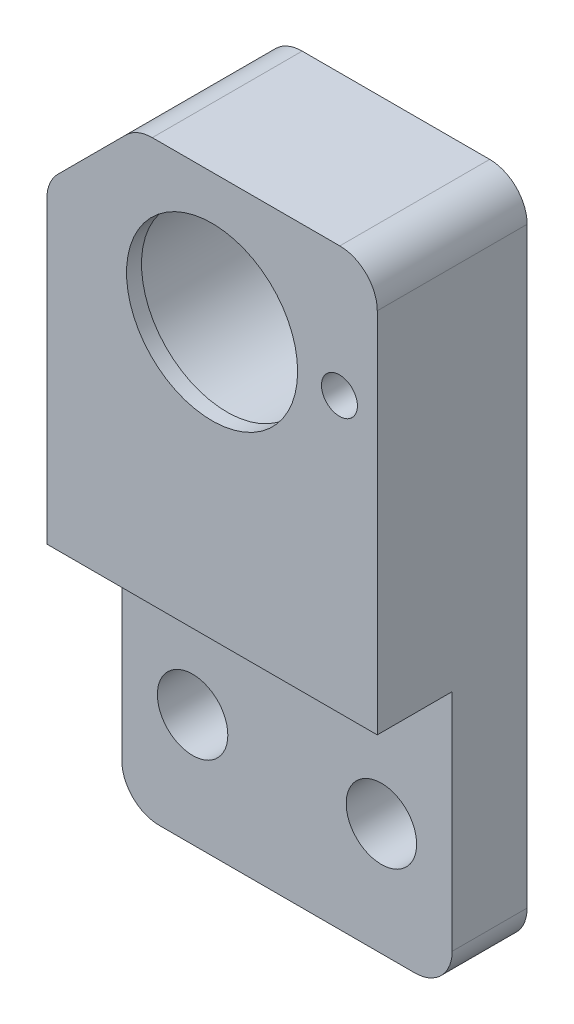
ISO-10303-21;
HEADER;
FILE_DESCRIPTION(('STEP AP214'),'2;1');
FILE_NAME('part.step','',(''),(''),'','','');
FILE_SCHEMA(('AUTOMOTIVE_DESIGN { 1 0 10303 214 1 1 1 1 }'));
ENDSEC;
DATA;
#1=APPLICATION_CONTEXT('core data for automotive mechanical design processes');
#2=APPLICATION_PROTOCOL_DEFINITION('international standard','automotive_design',2000,#1);
#3=PRODUCT_CONTEXT('',#1,'mechanical');
#4=PRODUCT('Part','Part','',(#3));
#5=PRODUCT_RELATED_PRODUCT_CATEGORY('part','',(#4));
#6=PRODUCT_DEFINITION_FORMATION('','',#4);
#7=PRODUCT_DEFINITION_CONTEXT('part definition',#1,'design');
#8=PRODUCT_DEFINITION('design','',#6,#7);
#9=PRODUCT_DEFINITION_SHAPE('','',#8);
#10=(LENGTH_UNIT() NAMED_UNIT(*) SI_UNIT(.MILLI.,.METRE.));
#11=(NAMED_UNIT(*) PLANE_ANGLE_UNIT() SI_UNIT($,.RADIAN.));
#12=(NAMED_UNIT(*) SI_UNIT($,.STERADIAN.) SOLID_ANGLE_UNIT());
#13=UNCERTAINTY_MEASURE_WITH_UNIT(LENGTH_MEASURE(1.E-05),#10,'distance_accuracy_value','');
#14=(GEOMETRIC_REPRESENTATION_CONTEXT(3) GLOBAL_UNCERTAINTY_ASSIGNED_CONTEXT((#13)) GLOBAL_UNIT_ASSIGNED_CONTEXT((#10,
#11,#12)) REPRESENTATION_CONTEXT('',''));
#15=CARTESIAN_POINT('',(0.,0.,0.));
#16=DIRECTION('',(0.,0.,1.));
#17=DIRECTION('',(1.,0.,0.));
#18=AXIS2_PLACEMENT_3D('',#15,#16,#17);
#19=CARTESIAN_POINT('',(225.31987165171,63.67054945062,12.7));
#20=DIRECTION('',(0.,1.,0.));
#21=DIRECTION('',(0.,0.,1.));
#22=AXIS2_PLACEMENT_3D('',#19,#20,#21);
#23=PLANE('',#22);
#24=DIRECTION('',(1.,0.,0.));
#25=VECTOR('',#24,1.);
#26=CARTESIAN_POINT('',(225.31987165171,63.67054945062,6.35));
#27=LINE('',#26,#25);
#28=CARTESIAN_POINT('',(214.49487165202,63.67054945062,6.35));
#29=VERTEX_POINT('',#28);
#30=CARTESIAN_POINT('',(236.1448716514,63.67054945062,6.35));
#31=VERTEX_POINT('',#30);
#32=EDGE_CURVE('E251',#29,#31,#27,.T.);
#33=ORIENTED_EDGE('',*,*,#32,.F.);
#34=DIRECTION('',(0.,0.,-1.));
#35=VECTOR('',#34,1.);
#36=CARTESIAN_POINT('',(214.49487165202,63.67054945062,12.7));
#37=LINE('',#36,#35);
#38=CARTESIAN_POINT('',(214.49487165202,63.67054945062,0.));
#39=VERTEX_POINT('',#38);
#40=EDGE_CURVE('E96',#29,#39,#37,.T.);
#41=ORIENTED_EDGE('',*,*,#40,.T.);
#42=DIRECTION('',(1.,0.,0.));
#43=VECTOR('',#42,1.);
#44=CARTESIAN_POINT('',(225.31987165171,63.67054945062,0.));
#45=LINE('',#44,#43);
#46=CARTESIAN_POINT('',(236.1448716514,63.67054945062,0.));
#47=VERTEX_POINT('',#46);
#48=EDGE_CURVE('E159',#39,#47,#45,.T.);
#49=ORIENTED_EDGE('',*,*,#48,.T.);
#50=DIRECTION('',(0.,0.,-1.));
#51=VECTOR('',#50,1.);
#52=CARTESIAN_POINT('',(236.1448716514,63.67054945062,12.7));
#53=LINE('',#52,#51);
#54=EDGE_CURVE('E11',#31,#47,#53,.T.);
#55=ORIENTED_EDGE('',*,*,#54,.F.);
#56=EDGE_LOOP('',(#33,#41,#49,#55));
#57=FACE_BOUND('',#56,.T.);
#58=ADVANCED_FACE('F33',(#57),#23,.F.);
#59=CARTESIAN_POINT('',(236.1448716514,66.84554945062,12.7));
#60=DIRECTION('',(0.,0.,-1.));
#61=DIRECTION('',(-1.,0.,0.));
#62=AXIS2_PLACEMENT_3D('',#59,#60,#61);
#63=CYLINDRICAL_SURFACE('',#62,3.175);
#64=CARTESIAN_POINT('',(236.1448716514,66.84554945062,6.35));
#65=DIRECTION('',(0.,0.,1.));
#66=DIRECTION('',(1.,0.,0.));
#67=AXIS2_PLACEMENT_3D('',#64,#65,#66);
#68=CIRCLE('',#67,3.175);
#69=CARTESIAN_POINT('',(239.3198716514,66.84554945062,6.35));
#70=VERTEX_POINT('',#69);
#71=EDGE_CURVE('E248',#31,#70,#68,.T.);
#72=ORIENTED_EDGE('',*,*,#71,.F.);
#73=ORIENTED_EDGE('',*,*,#54,.T.);
#74=CARTESIAN_POINT('',(236.1448716514,66.84554945062,0.));
#75=DIRECTION('',(0.,0.,1.));
#76=DIRECTION('',(1.,0.,0.));
#77=AXIS2_PLACEMENT_3D('',#74,#75,#76);
#78=CIRCLE('',#77,3.175);
#79=CARTESIAN_POINT('',(239.3198716514,66.84554945062,0.));
#80=VERTEX_POINT('',#79);
#81=EDGE_CURVE('E161',#47,#80,#78,.T.);
#82=ORIENTED_EDGE('',*,*,#81,.T.);
#83=DIRECTION('',(0.,0.,-1.));
#84=VECTOR('',#83,1.);
#85=CARTESIAN_POINT('',(239.3198716514,66.84554945062,12.7));
#86=LINE('',#85,#84);
#87=EDGE_CURVE('E41',#70,#80,#86,.T.);
#88=ORIENTED_EDGE('',*,*,#87,.F.);
#89=EDGE_LOOP('',(#72,#73,#82,#88));
#90=FACE_BOUND('',#89,.T.);
#91=ADVANCED_FACE('F207',(#90),#63,.T.);
#92=CARTESIAN_POINT('',(239.3198716514,42.7259684474256,12.7));
#93=DIRECTION('',(-1.,0.,0.));
#94=DIRECTION('',(0.,0.,1.));
#95=AXIS2_PLACEMENT_3D('',#92,#93,#94);
#96=PLANE('',#95);
#97=DIRECTION('',(0.,0.,1.));
#98=VECTOR('',#97,1.);
#99=CARTESIAN_POINT('',(239.3198716514,85.90062945062,6.35));
#100=LINE('',#99,#98);
#101=CARTESIAN_POINT('',(239.3198716514,85.90062945062,6.35));
#102=VERTEX_POINT('',#101);
#103=CARTESIAN_POINT('',(239.3198716514,85.90062945062,12.7));
#104=VERTEX_POINT('',#103);
#105=EDGE_CURVE('E48',#102,#104,#100,.T.);
#106=ORIENTED_EDGE('',*,*,#105,.F.);
#107=DIRECTION('',(0.,1.,0.));
#108=VECTOR('',#107,1.);
#109=CARTESIAN_POINT('',(239.3198716514,42.7259684474256,6.35));
#110=LINE('',#109,#108);
#111=EDGE_CURVE('E203',#70,#102,#110,.T.);
#112=ORIENTED_EDGE('',*,*,#111,.F.);
#113=ORIENTED_EDGE('',*,*,#87,.T.);
#114=DIRECTION('',(0.,1.,0.));
#115=VECTOR('',#114,1.);
#116=CARTESIAN_POINT('',(239.3198716514,42.7259684474256,0.));
#117=LINE('',#116,#115);
#118=CARTESIAN_POINT('',(239.3198716514,117.02562945094,0.));
#119=VERTEX_POINT('',#118);
#120=EDGE_CURVE('E164',#80,#119,#117,.T.);
#121=ORIENTED_EDGE('',*,*,#120,.T.);
#122=DIRECTION('',(0.,0.,-1.));
#123=VECTOR('',#122,1.);
#124=CARTESIAN_POINT('',(239.3198716514,117.02562945094,12.7));
#125=LINE('',#124,#123);
#126=CARTESIAN_POINT('',(239.3198716514,117.02562945094,12.7));
#127=VERTEX_POINT('',#126);
#128=EDGE_CURVE('E194',#127,#119,#125,.T.);
#129=ORIENTED_EDGE('',*,*,#128,.F.);
#130=DIRECTION('',(0.,1.,0.));
#131=VECTOR('',#130,1.);
#132=CARTESIAN_POINT('',(239.3198716514,42.7259684474256,12.7));
#133=LINE('',#132,#131);
#134=EDGE_CURVE('E104',#104,#127,#133,.T.);
#135=ORIENTED_EDGE('',*,*,#134,.F.);
#136=EDGE_LOOP('',(#106,#112,#113,#121,#129,#135));
#137=FACE_BOUND('',#136,.T.);
#138=ADVANCED_FACE('F199',(#137),#96,.F.);
#139=CARTESIAN_POINT('',(211.31987165202,42.7259684474256,12.7));
#140=DIRECTION('',(-1.,0.,0.));
#141=DIRECTION('',(0.,0.,1.));
#142=AXIS2_PLACEMENT_3D('',#139,#140,#141);
#143=PLANE('',#142);
#144=DIRECTION('',(0.,1.,0.));
#145=VECTOR('',#144,1.);
#146=CARTESIAN_POINT('',(211.31987165202,42.7259684474256,6.35));
#147=LINE('',#146,#145);
#148=CARTESIAN_POINT('',(211.31987165202,66.84554945062,6.35));
#149=VERTEX_POINT('',#148);
#150=CARTESIAN_POINT('',(211.31987165202,85.90062945062,6.35));
#151=VERTEX_POINT('',#150);
#152=EDGE_CURVE('E242',#149,#151,#147,.T.);
#153=ORIENTED_EDGE('',*,*,#152,.T.);
#154=DIRECTION('',(0.,0.,1.));
#155=VECTOR('',#154,1.);
#156=CARTESIAN_POINT('',(211.31987165202,85.90062945062,6.35));
#157=LINE('',#156,#155);
#158=CARTESIAN_POINT('',(211.31987165202,85.90062945062,12.7));
#159=VERTEX_POINT('',#158);
#160=EDGE_CURVE('E229',#151,#159,#157,.T.);
#161=ORIENTED_EDGE('',*,*,#160,.T.);
#162=DIRECTION('',(0.,1.,0.));
#163=VECTOR('',#162,1.);
#164=CARTESIAN_POINT('',(211.31987165202,42.7259684474256,12.7));
#165=LINE('',#164,#163);
#166=CARTESIAN_POINT('',(211.31987165202,111.26550139032,12.7));
#167=VERTEX_POINT('',#166);
#168=EDGE_CURVE('E57',#159,#167,#165,.T.);
#169=ORIENTED_EDGE('',*,*,#168,.T.);
#170=DIRECTION('',(0.,0.,-1.));
#171=VECTOR('',#170,1.);
#172=CARTESIAN_POINT('',(211.31987165202,111.26550139032,12.7));
#173=LINE('',#172,#171);
#174=CARTESIAN_POINT('',(211.31987165202,111.26550139032,0.));
#175=VERTEX_POINT('',#174);
#176=EDGE_CURVE('E187',#167,#175,#173,.T.);
#177=ORIENTED_EDGE('',*,*,#176,.T.);
#178=DIRECTION('',(0.,1.,0.));
#179=VECTOR('',#178,1.);
#180=CARTESIAN_POINT('',(211.31987165202,42.7259684474256,0.));
#181=LINE('',#180,#179);
#182=CARTESIAN_POINT('',(211.31987165202,66.84554945062,0.));
#183=VERTEX_POINT('',#182);
#184=EDGE_CURVE('E176',#183,#175,#181,.T.);
#185=ORIENTED_EDGE('',*,*,#184,.F.);
#186=DIRECTION('',(0.,0.,-1.));
#187=VECTOR('',#186,1.);
#188=CARTESIAN_POINT('',(211.31987165202,66.84554945062,12.7));
#189=LINE('',#188,#187);
#190=EDGE_CURVE('E185',#149,#183,#189,.T.);
#191=ORIENTED_EDGE('',*,*,#190,.F.);
#192=EDGE_LOOP('',(#153,#161,#169,#177,#185,#191));
#193=FACE_BOUND('',#192,.T.);
#194=ADVANCED_FACE('F277',(#193),#143,.T.);
#195=CARTESIAN_POINT('',(214.49487165202,66.84554945062,12.7));
#196=DIRECTION('',(0.,0.,-1.));
#197=DIRECTION('',(-1.,0.,0.));
#198=AXIS2_PLACEMENT_3D('',#195,#196,#197);
#199=CYLINDRICAL_SURFACE('',#198,3.17499999999999);
#200=CARTESIAN_POINT('',(214.49487165202,66.84554945062,6.35));
#201=DIRECTION('',(0.,0.,1.));
#202=DIRECTION('',(1.,0.,0.));
#203=AXIS2_PLACEMENT_3D('',#200,#201,#202);
#204=CIRCLE('',#203,3.17499999999999);
#205=EDGE_CURVE('E235',#149,#29,#204,.T.);
#206=ORIENTED_EDGE('',*,*,#205,.F.);
#207=ORIENTED_EDGE('',*,*,#190,.T.);
#208=CARTESIAN_POINT('',(214.49487165202,66.84554945062,0.));
#209=DIRECTION('',(0.,0.,1.));
#210=DIRECTION('',(1.,0.,0.));
#211=AXIS2_PLACEMENT_3D('',#208,#209,#210);
#212=CIRCLE('',#211,3.17499999999999);
#213=EDGE_CURVE('E179',#183,#39,#212,.T.);
#214=ORIENTED_EDGE('',*,*,#213,.T.);
#215=ORIENTED_EDGE('',*,*,#40,.F.);
#216=EDGE_LOOP('',(#206,#207,#214,#215));
#217=FACE_BOUND('',#216,.T.);
#218=ADVANCED_FACE('F288',(#217),#199,.T.);
#219=CARTESIAN_POINT('',(217.31987165098,73.20062945062,12.7));
#220=DIRECTION('',(0.,0.,-1.));
#221=DIRECTION('',(-1.,0.,0.));
#222=AXIS2_PLACEMENT_3D('',#219,#220,#221);
#223=CYLINDRICAL_SURFACE('',#222,2.9845);
#224=CARTESIAN_POINT('',(217.31987165098,73.20062945062,0.));
#225=DIRECTION('',(0.,0.,1.));
#226=DIRECTION('',(1.,0.,0.));
#227=AXIS2_PLACEMENT_3D('',#224,#225,#226);
#228=CIRCLE('',#227,2.9845);
#229=CARTESIAN_POINT('',(220.30437165098,73.20062945062,0.));
#230=VERTEX_POINT('',#229);
#231=EDGE_CURVE('E155',#230,#230,#228,.T.);
#232=ORIENTED_EDGE('',*,*,#231,.F.);
#233=EDGE_LOOP('',(#232));
#234=FACE_BOUND('',#233,.T.);
#235=CARTESIAN_POINT('',(217.31987165098,73.20062945062,6.35));
#236=DIRECTION('',(0.,0.,1.));
#237=DIRECTION('',(1.,0.,0.));
#238=AXIS2_PLACEMENT_3D('',#235,#236,#237);
#239=CIRCLE('',#238,2.9845);
#240=CARTESIAN_POINT('',(220.30437165098,73.20062945062,6.35));
#241=VERTEX_POINT('',#240);
#242=EDGE_CURVE('E254',#241,#241,#239,.T.);
#243=ORIENTED_EDGE('',*,*,#242,.T.);
#244=EDGE_LOOP('',(#243));
#245=FACE_BOUND('',#244,.T.);
#246=ADVANCED_FACE('F292',(#234,#245),#223,.F.);
#247=CARTESIAN_POINT('',(233.31987165244,73.20062945062,12.7));
#248=DIRECTION('',(0.,0.,-1.));
#249=DIRECTION('',(-1.,0.,0.));
#250=AXIS2_PLACEMENT_3D('',#247,#248,#249);
#251=CYLINDRICAL_SURFACE('',#250,2.9845);
#252=CARTESIAN_POINT('',(233.31987165244,73.20062945062,0.));
#253=DIRECTION('',(0.,0.,1.));
#254=DIRECTION('',(1.,0.,0.));
#255=AXIS2_PLACEMENT_3D('',#252,#253,#254);
#256=CIRCLE('',#255,2.9845);
#257=CARTESIAN_POINT('',(236.30437165244,73.20062945062,0.));
#258=VERTEX_POINT('',#257);
#259=EDGE_CURVE('E152',#258,#258,#256,.T.);
#260=ORIENTED_EDGE('',*,*,#259,.F.);
#261=EDGE_LOOP('',(#260));
#262=FACE_BOUND('',#261,.T.);
#263=CARTESIAN_POINT('',(233.31987165244,73.20062945062,6.35));
#264=DIRECTION('',(0.,0.,1.));
#265=DIRECTION('',(1.,0.,0.));
#266=AXIS2_PLACEMENT_3D('',#263,#264,#265);
#267=CIRCLE('',#266,2.9845);
#268=CARTESIAN_POINT('',(236.30437165244,73.20062945062,6.35));
#269=VERTEX_POINT('',#268);
#270=EDGE_CURVE('E239',#269,#269,#267,.T.);
#271=ORIENTED_EDGE('',*,*,#270,.T.);
#272=EDGE_LOOP('',(#271));
#273=FACE_BOUND('',#272,.T.);
#274=ADVANCED_FACE('F35',(#262,#273),#251,.F.);
#275=CARTESIAN_POINT('',(225.31987165171,42.7259684474256,12.7));
#276=DIRECTION('',(0.,0.,1.));
#277=DIRECTION('',(1.,0.,0.));
#278=AXIS2_PLACEMENT_3D('',#275,#276,#277);
#279=PLANE('',#278);
#280=CARTESIAN_POINT('',(225.31987165044,109.20062944946,12.7));
#281=DIRECTION('',(0.,0.,1.));
#282=DIRECTION('',(1.,0.,0.));
#283=AXIS2_PLACEMENT_3D('',#280,#281,#282);
#284=CIRCLE('',#283,7.25000000086001);
#285=CARTESIAN_POINT('',(232.5698716513,109.20062944946,12.7));
#286=VERTEX_POINT('',#285);
#287=EDGE_CURVE('E149',#286,#286,#284,.T.);
#288=ORIENTED_EDGE('',*,*,#287,.F.);
#289=EDGE_LOOP('',(#288));
#290=FACE_BOUND('',#289,.T.);
#291=CARTESIAN_POINT('',(236.11487165044,109.20062944946,12.7));
#292=DIRECTION('',(0.,0.,1.));
#293=DIRECTION('',(1.,0.,0.));
#294=AXIS2_PLACEMENT_3D('',#291,#292,#293);
#295=CIRCLE('',#294,1.524);
#296=CARTESIAN_POINT('',(237.63887165044,109.20062944946,12.7));
#297=VERTEX_POINT('',#296);
#298=EDGE_CURVE('E146',#297,#297,#295,.T.);
#299=ORIENTED_EDGE('',*,*,#298,.F.);
#300=EDGE_LOOP('',(#299));
#301=FACE_BOUND('',#300,.T.);
#302=ORIENTED_EDGE('',*,*,#168,.F.);
#303=DIRECTION('',(1.,0.,0.));
#304=VECTOR('',#303,1.);
#305=CARTESIAN_POINT('',(225.31987165171,85.90062945062,12.7));
#306=LINE('',#305,#304);
#307=EDGE_CURVE('E237',#159,#104,#306,.T.);
#308=ORIENTED_EDGE('',*,*,#307,.T.);
#309=ORIENTED_EDGE('',*,*,#134,.T.);
#310=CARTESIAN_POINT('',(236.1448716514,117.02562945097,12.7));
#311=DIRECTION('',(0.,0.,1.));
#312=DIRECTION('',(1.,0.,0.));
#313=AXIS2_PLACEMENT_3D('',#310,#311,#312);
#314=CIRCLE('',#313,3.175);
#315=CARTESIAN_POINT('',(236.14487165143,120.20062945097,12.7));
#316=VERTEX_POINT('',#315);
#317=EDGE_CURVE('E221',#127,#316,#314,.T.);
#318=ORIENTED_EDGE('',*,*,#317,.T.);
#319=DIRECTION('',(-1.,0.,0.));
#320=VECTOR('',#319,1.);
#321=CARTESIAN_POINT('',(225.31987165171,120.20062945097,12.7));
#322=LINE('',#321,#320);
#323=CARTESIAN_POINT('',(220.25499971267,120.20062945097,12.7));
#324=VERTEX_POINT('',#323);
#325=EDGE_CURVE('E122',#316,#324,#322,.T.);
#326=ORIENTED_EDGE('',*,*,#325,.T.);
#327=CARTESIAN_POINT('',(220.25499971267,117.02562945094,12.7));
#328=DIRECTION('',(0.,0.,1.));
#329=DIRECTION('',(1.,0.,0.));
#330=AXIS2_PLACEMENT_3D('',#327,#328,#329);
#331=CIRCLE('',#330,3.17500000003022);
#332=CARTESIAN_POINT('',(218.009935681112,119.270693479959,12.7));
#333=VERTEX_POINT('',#332);
#334=EDGE_CURVE('E115',#324,#333,#331,.T.);
#335=ORIENTED_EDGE('',*,*,#334,.T.);
#336=DIRECTION('',(-0.707106781186548,-0.707106781186548,0.));
#337=VECTOR('',#336,1.);
#338=CARTESIAN_POINT('',(183.392541150144,84.6532989489913,12.7));
#339=LINE('',#338,#337);
#340=CARTESIAN_POINT('',(212.249807620492,113.510565419339,12.7));
#341=VERTEX_POINT('',#340);
#342=EDGE_CURVE('E119',#333,#341,#339,.T.);
#343=ORIENTED_EDGE('',*,*,#342,.T.);
#344=CARTESIAN_POINT('',(214.49487165205,111.26550139032,12.7));
#345=DIRECTION('',(0.,0.,1.));
#346=DIRECTION('',(1.,0.,0.));
#347=AXIS2_PLACEMENT_3D('',#344,#345,#346);
#348=CIRCLE('',#347,3.17500000003021);
#349=EDGE_CURVE('E140',#341,#167,#348,.T.);
#350=ORIENTED_EDGE('',*,*,#349,.T.);
#351=EDGE_LOOP('',(#302,#308,#309,#318,#326,#335,#343,#350));
#352=FACE_BOUND('',#351,.T.);
#353=ADVANCED_FACE('F117',(#290,#301,#352),#279,.T.);
#354=CARTESIAN_POINT('',(225.31987165171,42.7259684474256,0.));
#355=DIRECTION('',(0.,0.,1.));
#356=DIRECTION('',(1.,0.,0.));
#357=AXIS2_PLACEMENT_3D('',#354,#355,#356);
#358=PLANE('',#357);
#359=CARTESIAN_POINT('',(236.11487165044,109.20062944946,0.));
#360=DIRECTION('',(0.,0.,1.));
#361=DIRECTION('',(1.,0.,0.));
#362=AXIS2_PLACEMENT_3D('',#359,#360,#361);
#363=CIRCLE('',#362,1.524);
#364=CARTESIAN_POINT('',(237.63887165044,109.20062944946,0.));
#365=VERTEX_POINT('',#364);
#366=EDGE_CURVE('E181',#365,#365,#363,.T.);
#367=ORIENTED_EDGE('',*,*,#366,.T.);
#368=EDGE_LOOP('',(#367));
#369=FACE_BOUND('',#368,.T.);
#370=ORIENTED_EDGE('',*,*,#48,.F.);
#371=ORIENTED_EDGE('',*,*,#213,.F.);
#372=ORIENTED_EDGE('',*,*,#184,.T.);
#373=CARTESIAN_POINT('',(214.49487165205,111.26550139032,0.));
#374=DIRECTION('',(0.,0.,1.));
#375=DIRECTION('',(1.,0.,0.));
#376=AXIS2_PLACEMENT_3D('',#373,#374,#375);
#377=CIRCLE('',#376,3.17500000003021);
#378=CARTESIAN_POINT('',(212.249807620492,113.510565419339,0.));
#379=VERTEX_POINT('',#378);
#380=EDGE_CURVE('E173',#379,#175,#377,.T.);
#381=ORIENTED_EDGE('',*,*,#380,.F.);
#382=DIRECTION('',(-0.707106781186548,-0.707106781186548,0.));
#383=VECTOR('',#382,1.);
#384=CARTESIAN_POINT('',(183.392541150144,84.6532989489913,0.));
#385=LINE('',#384,#383);
#386=CARTESIAN_POINT('',(218.009935681112,119.270693479959,0.));
#387=VERTEX_POINT('',#386);
#388=EDGE_CURVE('E171',#387,#379,#385,.T.);
#389=ORIENTED_EDGE('',*,*,#388,.F.);
#390=CARTESIAN_POINT('',(220.25499971267,117.02562945094,0.));
#391=DIRECTION('',(0.,0.,1.));
#392=DIRECTION('',(1.,0.,0.));
#393=AXIS2_PLACEMENT_3D('',#390,#391,#392);
#394=CIRCLE('',#393,3.17500000003022);
#395=CARTESIAN_POINT('',(220.25499971267,120.20062945097,0.));
#396=VERTEX_POINT('',#395);
#397=EDGE_CURVE('E131',#396,#387,#394,.T.);
#398=ORIENTED_EDGE('',*,*,#397,.F.);
#399=DIRECTION('',(-1.,0.,0.));
#400=VECTOR('',#399,1.);
#401=CARTESIAN_POINT('',(225.31987165171,120.20062945097,0.));
#402=LINE('',#401,#400);
#403=CARTESIAN_POINT('',(236.14487165143,120.20062945097,0.));
#404=VERTEX_POINT('',#403);
#405=EDGE_CURVE('E168',#404,#396,#402,.T.);
#406=ORIENTED_EDGE('',*,*,#405,.F.);
#407=CARTESIAN_POINT('',(236.1448716514,117.02562945097,0.));
#408=DIRECTION('',(0.,0.,1.));
#409=DIRECTION('',(1.,0.,0.));
#410=AXIS2_PLACEMENT_3D('',#407,#408,#409);
#411=CIRCLE('',#410,3.175);
#412=EDGE_CURVE('E166',#119,#404,#411,.T.);
#413=ORIENTED_EDGE('',*,*,#412,.F.);
#414=ORIENTED_EDGE('',*,*,#120,.F.);
#415=ORIENTED_EDGE('',*,*,#81,.F.);
#416=EDGE_LOOP('',(#370,#371,#372,#381,#389,#398,#406,#413,#414,#415));
#417=FACE_BOUND('',#416,.T.);
#418=ORIENTED_EDGE('',*,*,#231,.T.);
#419=EDGE_LOOP('',(#418));
#420=FACE_BOUND('',#419,.T.);
#421=ORIENTED_EDGE('',*,*,#259,.T.);
#422=EDGE_LOOP('',(#421));
#423=FACE_BOUND('',#422,.T.);
#424=CARTESIAN_POINT('',(225.31987165044,109.20062944946,0.));
#425=DIRECTION('',(0.,0.,1.));
#426=DIRECTION('',(1.,0.,0.));
#427=AXIS2_PLACEMENT_3D('',#424,#425,#426);
#428=CIRCLE('',#427,7.95019999999999);
#429=CARTESIAN_POINT('',(233.27007165044,109.20062944946,0.));
#430=VERTEX_POINT('',#429);
#431=EDGE_CURVE('E225',#430,#430,#428,.T.);
#432=ORIENTED_EDGE('',*,*,#431,.T.);
#433=EDGE_LOOP('',(#432));
#434=FACE_BOUND('',#433,.T.);
#435=ADVANCED_FACE('F212',(#369,#417,#420,#423,#434),#358,.F.);
#436=CARTESIAN_POINT('',(236.1448716514,117.02562945097,12.7));
#437=DIRECTION('',(0.,0.,-1.));
#438=DIRECTION('',(-1.,0.,0.));
#439=AXIS2_PLACEMENT_3D('',#436,#437,#438);
#440=CYLINDRICAL_SURFACE('',#439,3.175);
#441=ORIENTED_EDGE('',*,*,#412,.T.);
#442=DIRECTION('',(0.,0.,-1.));
#443=VECTOR('',#442,1.);
#444=CARTESIAN_POINT('',(236.14487165143,120.20062945097,12.7));
#445=LINE('',#444,#443);
#446=EDGE_CURVE('E191',#316,#404,#445,.T.);
#447=ORIENTED_EDGE('',*,*,#446,.F.);
#448=ORIENTED_EDGE('',*,*,#317,.F.);
#449=ORIENTED_EDGE('',*,*,#128,.T.);
#450=EDGE_LOOP('',(#441,#447,#448,#449));
#451=FACE_BOUND('',#450,.T.);
#452=ADVANCED_FACE('F217',(#451),#440,.T.);
#453=CARTESIAN_POINT('',(225.31987165171,120.20062945097,12.7));
#454=DIRECTION('',(0.,-1.,0.));
#455=DIRECTION('',(0.,0.,-1.));
#456=AXIS2_PLACEMENT_3D('',#453,#454,#455);
#457=PLANE('',#456);
#458=ORIENTED_EDGE('',*,*,#405,.T.);
#459=DIRECTION('',(0.,0.,-1.));
#460=VECTOR('',#459,1.);
#461=CARTESIAN_POINT('',(220.25499971267,120.20062945097,12.7));
#462=LINE('',#461,#460);
#463=EDGE_CURVE('E134',#324,#396,#462,.T.);
#464=ORIENTED_EDGE('',*,*,#463,.F.);
#465=ORIENTED_EDGE('',*,*,#325,.F.);
#466=ORIENTED_EDGE('',*,*,#446,.T.);
#467=EDGE_LOOP('',(#458,#464,#465,#466));
#468=FACE_BOUND('',#467,.T.);
#469=ADVANCED_FACE('F220',(#468),#457,.F.);
#470=CARTESIAN_POINT('',(220.25499971267,117.02562945094,12.7));
#471=DIRECTION('',(0.,0.,-1.));
#472=DIRECTION('',(-1.,0.,0.));
#473=AXIS2_PLACEMENT_3D('',#470,#471,#472);
#474=CYLINDRICAL_SURFACE('',#473,3.17500000003022);
#475=ORIENTED_EDGE('',*,*,#397,.T.);
#476=DIRECTION('',(0.,0.,-1.));
#477=VECTOR('',#476,1.);
#478=CARTESIAN_POINT('',(218.009935681112,119.270693479959,12.7));
#479=LINE('',#478,#477);
#480=EDGE_CURVE('E128',#333,#387,#479,.T.);
#481=ORIENTED_EDGE('',*,*,#480,.F.);
#482=ORIENTED_EDGE('',*,*,#334,.F.);
#483=ORIENTED_EDGE('',*,*,#463,.T.);
#484=EDGE_LOOP('',(#475,#481,#482,#483));
#485=FACE_BOUND('',#484,.T.);
#486=ADVANCED_FACE('F129',(#485),#474,.T.);
#487=CARTESIAN_POINT('',(183.392541150144,84.6532989489913,12.7));
#488=DIRECTION('',(0.707106781186548,-0.707106781186548,0.));
#489=DIRECTION('',(0.707106781186548,0.707106781186548,0.));
#490=AXIS2_PLACEMENT_3D('',#487,#488,#489);
#491=PLANE('',#490);
#492=ORIENTED_EDGE('',*,*,#388,.T.);
#493=DIRECTION('',(0.,0.,-1.));
#494=VECTOR('',#493,1.);
#495=CARTESIAN_POINT('',(212.249807620492,113.510565419339,12.7));
#496=LINE('',#495,#494);
#497=EDGE_CURVE('E135',#341,#379,#496,.T.);
#498=ORIENTED_EDGE('',*,*,#497,.F.);
#499=ORIENTED_EDGE('',*,*,#342,.F.);
#500=ORIENTED_EDGE('',*,*,#480,.T.);
#501=EDGE_LOOP('',(#492,#498,#499,#500));
#502=FACE_BOUND('',#501,.T.);
#503=ADVANCED_FACE('F137',(#502),#491,.F.);
#504=CARTESIAN_POINT('',(214.49487165205,111.26550139032,12.7));
#505=DIRECTION('',(0.,0.,-1.));
#506=DIRECTION('',(-1.,0.,0.));
#507=AXIS2_PLACEMENT_3D('',#504,#505,#506);
#508=CYLINDRICAL_SURFACE('',#507,3.17500000003021);
#509=ORIENTED_EDGE('',*,*,#380,.T.);
#510=ORIENTED_EDGE('',*,*,#176,.F.);
#511=ORIENTED_EDGE('',*,*,#349,.F.);
#512=ORIENTED_EDGE('',*,*,#497,.T.);
#513=EDGE_LOOP('',(#509,#510,#511,#512));
#514=FACE_BOUND('',#513,.T.);
#515=ADVANCED_FACE('F281',(#514),#508,.T.);
#516=CARTESIAN_POINT('',(236.11487165044,109.20062944946,12.7));
#517=DIRECTION('',(0.,0.,-1.));
#518=DIRECTION('',(-1.,0.,0.));
#519=AXIS2_PLACEMENT_3D('',#516,#517,#518);
#520=CYLINDRICAL_SURFACE('',#519,1.524);
#521=ORIENTED_EDGE('',*,*,#298,.T.);
#522=EDGE_LOOP('',(#521));
#523=FACE_BOUND('',#522,.T.);
#524=ORIENTED_EDGE('',*,*,#366,.F.);
#525=EDGE_LOOP('',(#524));
#526=FACE_BOUND('',#525,.T.);
#527=ADVANCED_FACE('F319',(#523,#526),#520,.F.);
#528=CARTESIAN_POINT('',(225.31987165044,109.20062944946,12.7));
#529=DIRECTION('',(0.,0.,-1.));
#530=DIRECTION('',(-1.,0.,0.));
#531=AXIS2_PLACEMENT_3D('',#528,#529,#530);
#532=CYLINDRICAL_SURFACE('',#531,7.25000000086001);
#533=CARTESIAN_POINT('',(225.31987165044,109.20062944946,11.43));
#534=DIRECTION('',(0.,0.,1.));
#535=DIRECTION('',(1.,0.,0.));
#536=AXIS2_PLACEMENT_3D('',#533,#534,#535);
#537=CIRCLE('',#536,7.25000000086001);
#538=CARTESIAN_POINT('',(232.5698716513,109.20062944946,11.43));
#539=VERTEX_POINT('',#538);
#540=EDGE_CURVE('E228',#539,#539,#537,.T.);
#541=ORIENTED_EDGE('',*,*,#540,.F.);
#542=EDGE_LOOP('',(#541));
#543=FACE_BOUND('',#542,.T.);
#544=ORIENTED_EDGE('',*,*,#287,.T.);
#545=EDGE_LOOP('',(#544));
#546=FACE_BOUND('',#545,.T.);
#547=ADVANCED_FACE('F323',(#543,#546),#532,.F.);
#548=CARTESIAN_POINT('',(225.31987165044,109.20062944946,11.43));
#549=DIRECTION('',(0.,0.,-1.));
#550=DIRECTION('',(-1.,0.,0.));
#551=AXIS2_PLACEMENT_3D('',#548,#549,#550);
#552=CYLINDRICAL_SURFACE('',#551,7.95019999999999);
#553=CARTESIAN_POINT('',(225.31987165044,109.20062944946,11.43));
#554=DIRECTION('',(0.,0.,1.));
#555=DIRECTION('',(1.,0.,0.));
#556=AXIS2_PLACEMENT_3D('',#553,#554,#555);
#557=CIRCLE('',#556,7.95019999999999);
#558=CARTESIAN_POINT('',(233.27007165044,109.20062944946,11.43));
#559=VERTEX_POINT('',#558);
#560=EDGE_CURVE('E156',#559,#559,#557,.T.);
#561=ORIENTED_EDGE('',*,*,#560,.T.);
#562=EDGE_LOOP('',(#561));
#563=FACE_BOUND('',#562,.T.);
#564=ORIENTED_EDGE('',*,*,#431,.F.);
#565=EDGE_LOOP('',(#564));
#566=FACE_BOUND('',#565,.T.);
#567=ADVANCED_FACE('F328',(#563,#566),#552,.F.);
#568=CARTESIAN_POINT('',(225.31987165171,42.7259684474256,11.43));
#569=DIRECTION('',(0.,0.,1.));
#570=DIRECTION('',(1.,0.,0.));
#571=AXIS2_PLACEMENT_3D('',#568,#569,#570);
#572=PLANE('',#571);
#573=ORIENTED_EDGE('',*,*,#540,.T.);
#574=EDGE_LOOP('',(#573));
#575=FACE_BOUND('',#574,.T.);
#576=ORIENTED_EDGE('',*,*,#560,.F.);
#577=EDGE_LOOP('',(#576));
#578=FACE_BOUND('',#577,.T.);
#579=ADVANCED_FACE('F341',(#575,#578),#572,.F.);
#580=CARTESIAN_POINT('',(225.31987165171,85.90062945062,6.35));
#581=DIRECTION('',(0.,-1.,0.));
#582=DIRECTION('',(0.,0.,-1.));
#583=AXIS2_PLACEMENT_3D('',#580,#581,#582);
#584=PLANE('',#583);
#585=ORIENTED_EDGE('',*,*,#307,.F.);
#586=ORIENTED_EDGE('',*,*,#160,.F.);
#587=DIRECTION('',(1.,0.,0.));
#588=VECTOR('',#587,1.);
#589=CARTESIAN_POINT('',(225.31987165171,85.90062945062,6.35));
#590=LINE('',#589,#588);
#591=EDGE_CURVE('E245',#151,#102,#590,.T.);
#592=ORIENTED_EDGE('',*,*,#591,.T.);
#593=ORIENTED_EDGE('',*,*,#105,.T.);
#594=EDGE_LOOP('',(#585,#586,#592,#593));
#595=FACE_BOUND('',#594,.T.);
#596=ADVANCED_FACE('F264',(#595),#584,.T.);
#597=CARTESIAN_POINT('',(225.31987165171,42.7259684474256,6.35));
#598=DIRECTION('',(0.,0.,1.));
#599=DIRECTION('',(1.,0.,0.));
#600=AXIS2_PLACEMENT_3D('',#597,#598,#599);
#601=PLANE('',#600);
#602=ORIENTED_EDGE('',*,*,#270,.F.);
#603=EDGE_LOOP('',(#602));
#604=FACE_BOUND('',#603,.T.);
#605=ORIENTED_EDGE('',*,*,#242,.F.);
#606=EDGE_LOOP('',(#605));
#607=FACE_BOUND('',#606,.T.);
#608=ORIENTED_EDGE('',*,*,#32,.T.);
#609=ORIENTED_EDGE('',*,*,#71,.T.);
#610=ORIENTED_EDGE('',*,*,#111,.T.);
#611=ORIENTED_EDGE('',*,*,#591,.F.);
#612=ORIENTED_EDGE('',*,*,#152,.F.);
#613=ORIENTED_EDGE('',*,*,#205,.T.);
#614=EDGE_LOOP('',(#608,#609,#610,#611,#612,#613));
#615=FACE_BOUND('',#614,.T.);
#616=ADVANCED_FACE('F261',(#604,#607,#615),#601,.T.);
#617=CLOSED_SHELL('',(#58,#91,#138,#194,#218,#246,#274,#353,#435,#452,#469,#486,#503,#515,#527,
#547,#567,#579,#596,#616));
#618=MANIFOLD_SOLID_BREP('B2',#617);
#619=ADVANCED_BREP_SHAPE_REPRESENTATION('',(#18,#618),#14);
#620=SHAPE_DEFINITION_REPRESENTATION(#9,#619);
ENDSEC;
END-ISO-10303-21;
